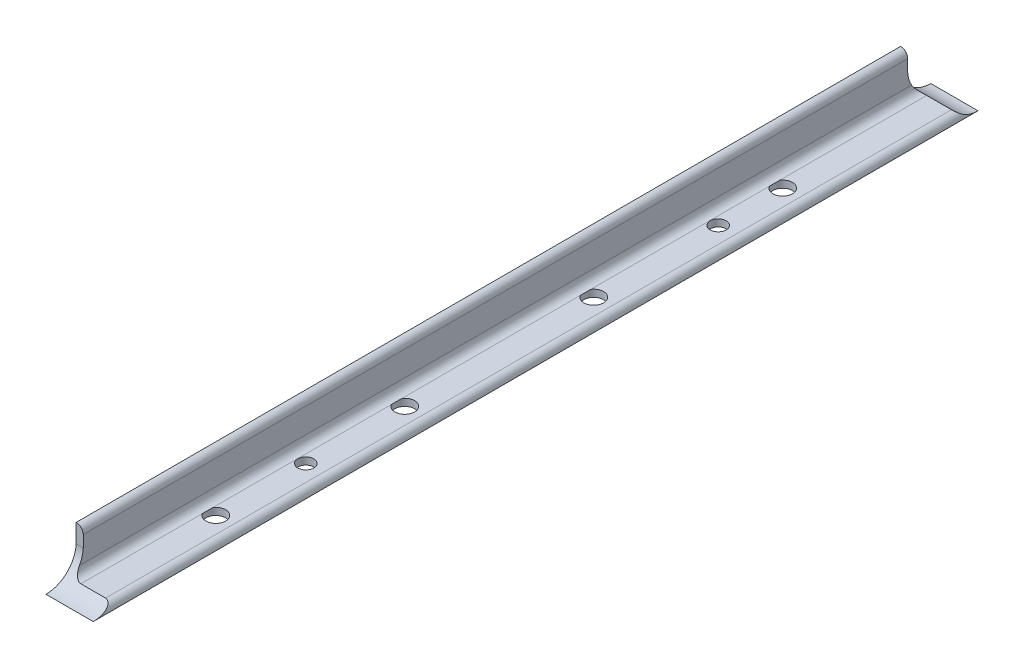
ISO-10303-21;
HEADER;
FILE_DESCRIPTION(('STEP AP214'),'2;1');
FILE_NAME('part.step','',(''),(''),'','','');
FILE_SCHEMA(('AUTOMOTIVE_DESIGN { 1 0 10303 214 1 1 1 1 }'));
ENDSEC;
DATA;
#1=APPLICATION_CONTEXT('core data for automotive mechanical design processes');
#2=APPLICATION_PROTOCOL_DEFINITION('international standard','automotive_design',2000,#1);
#3=PRODUCT_CONTEXT('',#1,'mechanical');
#4=PRODUCT('Part','Part','',(#3));
#5=PRODUCT_RELATED_PRODUCT_CATEGORY('part','',(#4));
#6=PRODUCT_DEFINITION_FORMATION('','',#4);
#7=PRODUCT_DEFINITION_CONTEXT('part definition',#1,'design');
#8=PRODUCT_DEFINITION('design','',#6,#7);
#9=PRODUCT_DEFINITION_SHAPE('','',#8);
#10=(LENGTH_UNIT() NAMED_UNIT(*) SI_UNIT(.MILLI.,.METRE.));
#11=(NAMED_UNIT(*) PLANE_ANGLE_UNIT() SI_UNIT($,.RADIAN.));
#12=(NAMED_UNIT(*) SI_UNIT($,.STERADIAN.) SOLID_ANGLE_UNIT());
#13=UNCERTAINTY_MEASURE_WITH_UNIT(LENGTH_MEASURE(1.E-05),#10,'distance_accuracy_value','');
#14=(GEOMETRIC_REPRESENTATION_CONTEXT(3) GLOBAL_UNCERTAINTY_ASSIGNED_CONTEXT((#13)) GLOBAL_UNIT_ASSIGNED_CONTEXT((#10,
#11,#12)) REPRESENTATION_CONTEXT('',''));
#15=CARTESIAN_POINT('',(0.,0.,0.));
#16=DIRECTION('',(0.,0.,1.));
#17=DIRECTION('',(1.,0.,0.));
#18=AXIS2_PLACEMENT_3D('',#15,#16,#17);
#19=CARTESIAN_POINT('',(20.,0.,181.370967741935));
#20=DIRECTION('',(0.,1.,0.));
#21=DIRECTION('',(0.,0.,1.));
#22=AXIS2_PLACEMENT_3D('',#19,#20,#21);
#23=PLANE('',#22);
#24=CARTESIAN_POINT('',(9.99999999999801,0.,-120.529032258062));
#25=DIRECTION('',(0.,-1.,0.));
#26=DIRECTION('',(0.,0.,-1.));
#27=AXIS2_PLACEMENT_3D('',#24,#25,#26);
#28=CIRCLE('',#27,4.1671875);
#29=CARTESIAN_POINT('',(9.99999999999801,0.,-124.696219758062));
#30=VERTEX_POINT('',#29);
#31=EDGE_CURVE('E244',#30,#30,#28,.T.);
#32=ORIENTED_EDGE('',*,*,#31,.F.);
#33=EDGE_LOOP('',(#32));
#34=FACE_BOUND('',#33,.T.);
#35=CARTESIAN_POINT('',(9.99999999999923,0.,119.470967741938));
#36=DIRECTION('',(0.,-1.,0.));
#37=DIRECTION('',(0.,0.,-1.));
#38=AXIS2_PLACEMENT_3D('',#35,#36,#37);
#39=CIRCLE('',#38,4.1671875);
#40=CARTESIAN_POINT('',(9.99999999999923,0.,115.303780241938));
#41=VERTEX_POINT('',#40);
#42=EDGE_CURVE('E249',#41,#41,#39,.T.);
#43=ORIENTED_EDGE('',*,*,#42,.F.);
#44=EDGE_LOOP('',(#43));
#45=FACE_BOUND('',#44,.T.);
#46=CARTESIAN_POINT('',(9.99999999999879,0.,39.4709677419378));
#47=DIRECTION('',(0.,-1.,0.));
#48=DIRECTION('',(0.,0.,-1.));
#49=AXIS2_PLACEMENT_3D('',#46,#47,#48);
#50=CIRCLE('',#49,4.1671875);
#51=CARTESIAN_POINT('',(9.99999999999879,0.,35.3037802419378));
#52=VERTEX_POINT('',#51);
#53=EDGE_CURVE('E255',#52,#52,#50,.T.);
#54=ORIENTED_EDGE('',*,*,#53,.F.);
#55=EDGE_LOOP('',(#54));
#56=FACE_BOUND('',#55,.T.);
#57=CARTESIAN_POINT('',(9.99999999999845,0.,-40.5290322580622));
#58=DIRECTION('',(0.,-1.,0.));
#59=DIRECTION('',(0.,0.,-1.));
#60=AXIS2_PLACEMENT_3D('',#57,#58,#59);
#61=CIRCLE('',#60,4.1671875);
#62=CARTESIAN_POINT('',(9.99999999999845,0.,-44.6962197580622));
#63=VERTEX_POINT('',#62);
#64=EDGE_CURVE('E177',#63,#63,#61,.T.);
#65=ORIENTED_EDGE('',*,*,#64,.F.);
#66=EDGE_LOOP('',(#65));
#67=FACE_BOUND('',#66,.T.);
#68=CARTESIAN_POINT('',(10.,0.,-93.2290322580646));
#69=DIRECTION('',(0.,-1.,0.));
#70=DIRECTION('',(0.,0.,-1.));
#71=AXIS2_PLACEMENT_3D('',#68,#69,#70);
#72=CIRCLE('',#71,3.3782);
#73=CARTESIAN_POINT('',(10.,0.,-96.6072322580646));
#74=VERTEX_POINT('',#73);
#75=EDGE_CURVE('E259',#74,#74,#72,.T.);
#76=ORIENTED_EDGE('',*,*,#75,.F.);
#77=EDGE_LOOP('',(#76));
#78=FACE_BOUND('',#77,.T.);
#79=DIRECTION('',(1.,0.,0.));
#80=VECTOR('',#79,1.);
#81=CARTESIAN_POINT('',(20.,0.,-193.229032258065));
#82=LINE('',#81,#80);
#83=CARTESIAN_POINT('',(0.,0.,-193.229032258065));
#84=VERTEX_POINT('',#83);
#85=CARTESIAN_POINT('',(20.,0.,-193.229032258065));
#86=VERTEX_POINT('',#85);
#87=EDGE_CURVE('E206',#84,#86,#82,.T.);
#88=ORIENTED_EDGE('',*,*,#87,.T.);
#89=DIRECTION('',(0.,0.,-1.));
#90=VECTOR('',#89,1.);
#91=CARTESIAN_POINT('',(20.,0.,181.370967741935));
#92=LINE('',#91,#90);
#93=CARTESIAN_POINT('',(20.,0.,181.370967741935));
#94=VERTEX_POINT('',#93);
#95=EDGE_CURVE('E70',#94,#86,#92,.T.);
#96=ORIENTED_EDGE('',*,*,#95,.F.);
#97=DIRECTION('',(1.,0.,0.));
#98=VECTOR('',#97,1.);
#99=CARTESIAN_POINT('',(20.,0.,181.370967741935));
#100=LINE('',#99,#98);
#101=CARTESIAN_POINT('',(0.,0.,181.370967741935));
#102=VERTEX_POINT('',#101);
#103=EDGE_CURVE('E213',#102,#94,#100,.T.);
#104=ORIENTED_EDGE('',*,*,#103,.F.);
#105=DIRECTION('',(0.,0.,-1.));
#106=VECTOR('',#105,1.);
#107=CARTESIAN_POINT('',(0.,0.,181.370967741935));
#108=LINE('',#107,#106);
#109=EDGE_CURVE('E209',#102,#84,#108,.T.);
#110=ORIENTED_EDGE('',*,*,#109,.T.);
#111=EDGE_LOOP('',(#88,#96,#104,#110));
#112=FACE_BOUND('',#111,.T.);
#113=CARTESIAN_POINT('',(10.,0.,81.3709677419355));
#114=DIRECTION('',(0.,-1.,0.));
#115=DIRECTION('',(0.,0.,-1.));
#116=AXIS2_PLACEMENT_3D('',#113,#114,#115);
#117=CIRCLE('',#116,3.3782);
#118=CARTESIAN_POINT('',(10.,0.,77.9927677419355));
#119=VERTEX_POINT('',#118);
#120=EDGE_CURVE('E168',#119,#119,#117,.T.);
#121=ORIENTED_EDGE('',*,*,#120,.F.);
#122=EDGE_LOOP('',(#121));
#123=FACE_BOUND('',#122,.T.);
#124=ADVANCED_FACE('F62',(#34,#45,#56,#67,#78,#112,#123),#23,.F.);
#125=CARTESIAN_POINT('',(3.,17.,181.370967741935));
#126=DIRECTION('',(-1.,0.,0.));
#127=DIRECTION('',(0.,-1.,0.));
#128=AXIS2_PLACEMENT_3D('',#125,#126,#127);
#129=PLANE('',#128);
#130=DIRECTION('',(0.,-1.,0.));
#131=VECTOR('',#130,1.);
#132=CARTESIAN_POINT('',(3.,17.,-180.447153459444));
#133=LINE('',#132,#131);
#134=CARTESIAN_POINT('',(3.,17.,-180.447153459444));
#135=VERTEX_POINT('',#134);
#136=CARTESIAN_POINT('',(3.,12.1191370348098,-180.447153459444));
#137=VERTEX_POINT('',#136);
#138=EDGE_CURVE('E302',#135,#137,#133,.T.);
#139=ORIENTED_EDGE('',*,*,#138,.F.);
#140=DIRECTION('',(0.,0.,-1.));
#141=VECTOR('',#140,1.);
#142=CARTESIAN_POINT('',(3.,17.,181.370967741935));
#143=LINE('',#142,#141);
#144=CARTESIAN_POINT('',(3.,17.,168.589088943315));
#145=VERTEX_POINT('',#144);
#146=EDGE_CURVE('E224',#145,#135,#143,.T.);
#147=ORIENTED_EDGE('',*,*,#146,.F.);
#148=DIRECTION('',(0.,-1.,0.));
#149=VECTOR('',#148,1.);
#150=CARTESIAN_POINT('',(3.,17.,168.589088943315));
#151=LINE('',#150,#149);
#152=CARTESIAN_POINT('',(3.,12.1191370348098,168.589088943315));
#153=VERTEX_POINT('',#152);
#154=EDGE_CURVE('E214',#145,#153,#151,.T.);
#155=ORIENTED_EDGE('',*,*,#154,.T.);
#156=CARTESIAN_POINT('',(3.,12.8,181.370967741935));
#157=DIRECTION('',(-1.,0.,0.));
#158=DIRECTION('',(0.,-1.,0.));
#159=AXIS2_PLACEMENT_3D('',#156,#157,#158);
#160=CIRCLE('',#159,12.8);
#161=CARTESIAN_POINT('',(3.,6.5,170.228705853073));
#162=VERTEX_POINT('',#161);
#163=EDGE_CURVE('E331',#162,#153,#160,.F.);
#164=ORIENTED_EDGE('',*,*,#163,.F.);
#165=DIRECTION('',(0.,0.,-1.));
#166=VECTOR('',#165,1.);
#167=CARTESIAN_POINT('',(3.,6.5,181.370967741935));
#168=LINE('',#167,#166);
#169=CARTESIAN_POINT('',(3.,6.5,-182.086770369202));
#170=VERTEX_POINT('',#169);
#171=EDGE_CURVE('E189',#162,#170,#168,.T.);
#172=ORIENTED_EDGE('',*,*,#171,.T.);
#173=CARTESIAN_POINT('',(3.,12.8,-193.229032258065));
#174=DIRECTION('',(-1.,0.,0.));
#175=DIRECTION('',(0.,-1.,0.));
#176=AXIS2_PLACEMENT_3D('',#173,#174,#175);
#177=CIRCLE('',#176,12.8);
#178=EDGE_CURVE('E272',#170,#137,#177,.T.);
#179=ORIENTED_EDGE('',*,*,#178,.T.);
#180=EDGE_LOOP('',(#139,#147,#155,#164,#172,#179));
#181=FACE_BOUND('',#180,.T.);
#182=ADVANCED_FACE('F344',(#181),#129,.F.);
#183=CARTESIAN_POINT('',(0.,0.,181.370967741935));
#184=DIRECTION('',(1.,0.,0.));
#185=DIRECTION('',(0.,0.,-1.));
#186=AXIS2_PLACEMENT_3D('',#183,#184,#185);
#187=PLANE('',#186);
#188=DIRECTION('',(0.,-1.,0.));
#189=VECTOR('',#188,1.);
#190=CARTESIAN_POINT('',(0.,22.8519845918242,-180.447153459444));
#191=LINE('',#190,#189);
#192=CARTESIAN_POINT('',(0.,20.,-180.447153459444));
#193=VERTEX_POINT('',#192);
#194=CARTESIAN_POINT('',(0.,12.1191370348098,-180.447153459444));
#195=VERTEX_POINT('',#194);
#196=EDGE_CURVE('E269',#193,#195,#191,.T.);
#197=ORIENTED_EDGE('',*,*,#196,.T.);
#198=CARTESIAN_POINT('',(0.,12.8,-193.229032258065));
#199=DIRECTION('',(-1.,0.,0.));
#200=DIRECTION('',(0.,0.,1.));
#201=AXIS2_PLACEMENT_3D('',#198,#199,#200);
#202=CIRCLE('',#201,12.8);
#203=EDGE_CURVE('E267',#84,#195,#202,.T.);
#204=ORIENTED_EDGE('',*,*,#203,.F.);
#205=ORIENTED_EDGE('',*,*,#109,.F.);
#206=CARTESIAN_POINT('',(0.,12.8,181.370967741935));
#207=DIRECTION('',(-1.,0.,0.));
#208=DIRECTION('',(0.,0.,1.));
#209=AXIS2_PLACEMENT_3D('',#206,#207,#208);
#210=CIRCLE('',#209,12.8);
#211=CARTESIAN_POINT('',(0.,12.1191370348098,168.589088943315));
#212=VERTEX_POINT('',#211);
#213=EDGE_CURVE('E337',#102,#212,#210,.F.);
#214=ORIENTED_EDGE('',*,*,#213,.T.);
#215=DIRECTION('',(0.,-1.,0.));
#216=VECTOR('',#215,1.);
#217=CARTESIAN_POINT('',(0.,0.,168.589088943315));
#218=LINE('',#217,#216);
#219=CARTESIAN_POINT('',(0.,20.,168.589088943315));
#220=VERTEX_POINT('',#219);
#221=EDGE_CURVE('E335',#220,#212,#218,.T.);
#222=ORIENTED_EDGE('',*,*,#221,.F.);
#223=DIRECTION('',(0.,0.,-1.));
#224=VECTOR('',#223,1.);
#225=CARTESIAN_POINT('',(0.,20.,181.370967741935));
#226=LINE('',#225,#224);
#227=EDGE_CURVE('E222',#220,#193,#226,.T.);
#228=ORIENTED_EDGE('',*,*,#227,.T.);
#229=EDGE_LOOP('',(#197,#204,#205,#214,#222,#228));
#230=FACE_BOUND('',#229,.T.);
#231=ADVANCED_FACE('F322',(#230),#187,.F.);
#232=CARTESIAN_POINT('',(0.,17.,181.370967741935));
#233=DIRECTION('',(0.,0.,-1.));
#234=DIRECTION('',(-1.,0.,0.));
#235=AXIS2_PLACEMENT_3D('',#232,#233,#234);
#236=CYLINDRICAL_SURFACE('',#235,3.);
#237=CARTESIAN_POINT('',(0.,17.,-180.447153459444));
#238=DIRECTION('',(0.,0.,-1.));
#239=DIRECTION('',(-1.,0.,0.));
#240=AXIS2_PLACEMENT_3D('',#237,#238,#239);
#241=CIRCLE('',#240,3.);
#242=EDGE_CURVE('E13',#193,#135,#241,.T.);
#243=ORIENTED_EDGE('',*,*,#242,.F.);
#244=ORIENTED_EDGE('',*,*,#227,.F.);
#245=CARTESIAN_POINT('',(0.,17.,168.589088943315));
#246=DIRECTION('',(0.,0.,-1.));
#247=DIRECTION('',(-1.,0.,0.));
#248=AXIS2_PLACEMENT_3D('',#245,#246,#247);
#249=CIRCLE('',#248,3.);
#250=EDGE_CURVE('E218',#220,#145,#249,.T.);
#251=ORIENTED_EDGE('',*,*,#250,.T.);
#252=ORIENTED_EDGE('',*,*,#146,.T.);
#253=EDGE_LOOP('',(#243,#244,#251,#252));
#254=FACE_BOUND('',#253,.T.);
#255=ADVANCED_FACE('F306',(#254),#236,.T.);
#256=CARTESIAN_POINT('',(17.,0.,181.370967741935));
#257=DIRECTION('',(0.,0.,-1.));
#258=DIRECTION('',(-1.,0.,0.));
#259=AXIS2_PLACEMENT_3D('',#256,#257,#258);
#260=CYLINDRICAL_SURFACE('',#259,3.);
#261=ORIENTED_EDGE('',*,*,#95,.T.);
#262=CARTESIAN_POINT('',(20.,0.,-193.229032258065));
#263=CARTESIAN_POINT('',(19.9999705919109,-2.30458044444742E-06,-193.051286959261));
#264=CARTESIAN_POINT('',(19.9999989770571,0.00370226592439756,-192.873541801661));
#265=CARTESIAN_POINT('',(19.9999599122282,0.0185087719111421,-192.518355839031));
#266=CARTESIAN_POINT('',(19.9998924600866,0.0296108746273757,-192.340915040974));
#267=CARTESIAN_POINT('',(19.9994499094464,0.0592209383889576,-191.986352009699));
#268=CARTESIAN_POINT('',(19.9990742937025,0.0777413240784776,-191.809230814235));
#269=CARTESIAN_POINT('',(19.9975949282692,0.12215425429108,-191.455920397352));
#270=CARTESIAN_POINT('',(19.9964911898514,0.148046684689877,-191.279731161548));
#271=CARTESIAN_POINT('',(19.9929752074295,0.207329591468886,-190.927571761546));
#272=CARTESIAN_POINT('',(19.990555359875,0.240762970703647,-190.751608884925));
#273=CARTESIAN_POINT('',(19.9836522455287,0.314973916303353,-190.401280315793));
#274=CARTESIAN_POINT('',(19.9791690254037,0.355751316557974,-190.226914587251));
#275=CARTESIAN_POINT('',(19.967222709024,0.44451448317191,-189.880308753322));
#276=CARTESIAN_POINT('',(19.9597625459986,0.49249312508783,-189.708066727127));
#277=CARTESIAN_POINT('',(19.9407600650472,0.595547736239835,-189.365970487646));
#278=CARTESIAN_POINT('',(19.9292185156823,0.650622367998199,-189.196115831055));
#279=CARTESIAN_POINT('',(19.9024685493768,0.760575693164321,-188.879685982737));
#280=CARTESIAN_POINT('',(19.887874684371,0.814667920668091,-188.732786020236));
#281=CARTESIAN_POINT('',(19.853481433853,0.927982337980096,-188.441590472269));
#282=CARTESIAN_POINT('',(19.8336823059246,0.987204273846342,-188.297294758309));
#283=CARTESIAN_POINT('',(19.7876954025515,1.11044027648881,-188.011913254042));
#284=CARTESIAN_POINT('',(19.7615123704582,1.17445076092479,-187.870825165116));
#285=CARTESIAN_POINT('',(19.7013693405175,1.30686409439147,-187.592404327919));
#286=CARTESIAN_POINT('',(19.6674102916596,1.37526640670856,-187.455071123687));
#287=CARTESIAN_POINT('',(19.5957588590613,1.50556478484685,-187.204694396706));
#288=CARTESIAN_POINT('',(19.5593322138692,1.56695585378169,-187.091028274171));
#289=CARTESIAN_POINT('',(19.4785163705227,1.69189081979229,-186.867721539012));
#290=CARTESIAN_POINT('',(19.4341258880657,1.75543506276088,-186.758081579115));
#291=CARTESIAN_POINT('',(19.3362692288105,1.88370363459148,-186.543974007168));
#292=CARTESIAN_POINT('',(19.2828231460853,1.94842507345107,-186.439495590787));
#293=CARTESIAN_POINT('',(19.1655479709184,2.07798702817958,-186.236685701539));
#294=CARTESIAN_POINT('',(19.101725952208,2.14282743337524,-186.138350103626));
#295=CARTESIAN_POINT('',(18.949823164493,2.28269447552457,-185.932154258203));
#296=CARTESIAN_POINT('',(18.859443382443,2.35745098877728,-185.825771184952));
#297=CARTESIAN_POINT('',(18.6607215587142,2.50140061225797,-185.62680223184));
#298=CARTESIAN_POINT('',(18.5523984627189,2.57059947737115,-185.534201992933));
#299=CARTESIAN_POINT('',(18.3377433168696,2.68750138374115,-185.381421994537));
#300=CARTESIAN_POINT('',(18.2343482603598,2.73684935436312,-185.318404616478));
#301=CARTESIAN_POINT('',(18.0157301558414,2.82526779578833,-185.207200865328));
#302=CARTESIAN_POINT('',(17.9005149294212,2.86434500270211,-185.159004768111));
#303=CARTESIAN_POINT('',(17.6772358802356,2.9245227102832,-185.085513498367));
#304=CARTESIAN_POINT('',(17.5703779091804,2.94735939747825,-185.057976395426));
#305=CARTESIAN_POINT('',(17.3522544969218,2.98127870354691,-185.017245847923));
#306=CARTESIAN_POINT('',(17.2409999263106,2.99238863543523,-185.004019071095));
#307=CARTESIAN_POINT('',(17.1077454898132,2.99814309911651,-184.997167444306));
#308=CARTESIAN_POINT('',(17.0862001547962,2.99883941073956,-184.996338319584));
#309=CARTESIAN_POINT('',(17.0431054203398,2.99976710034989,-184.995233756004));
#310=CARTESIAN_POINT('',(17.0215560434937,2.99999891199695,-184.994957800703));
#311=CARTESIAN_POINT('',(17.,3.,-184.994956717969));
#312=B_SPLINE_CURVE_WITH_KNOTS('',3,(#262,#263,#264,#265,#266,#267,#268,#269,#270,#271,#272,
#273,#274,#275,#276,#277,#278,#279,#280,#281,#282,#283,#284,#285,#286,#287,#288,#289,#290,#291,
#292,#293,#294,#295,#296,#297,#298,#299,#300,#301,#302,#303,#304,#305,#306,#307,#308,#309,#310,
#311),.UNSPECIFIED.,.F.,.F.,(4,2,2,2,2,2,2,2,2,2,2,2,2,2,2,2,2,2,2,2,2,2,2,2,4),(0.,
0.533197095279341,1.06640624483334,1.60051220873634,2.13460990476388,2.67182653411167,
3.20903101398115,3.74570747957591,4.28228293803239,4.75377659608734,5.22524692656226,
5.69636800828244,6.16743162473256,6.56983043551348,6.97229419829314,7.3738763309348,
7.77518582667768,8.24881684700326,8.72195092873459,9.11270874235857,9.50320963318574,
9.83984379905433,10.1756921618371,10.2404043939398,10.3050561821395),.UNSPECIFIED.);
#313=CARTESIAN_POINT('',(17.,3.,-184.994956717969));
#314=VERTEX_POINT('',#313);
#315=EDGE_CURVE('E201',#86,#314,#312,.T.);
#316=ORIENTED_EDGE('',*,*,#315,.T.);
#317=DIRECTION('',(0.,0.,-1.));
#318=VECTOR('',#317,1.);
#319=CARTESIAN_POINT('',(17.,3.,181.370967741935));
#320=LINE('',#319,#318);
#321=CARTESIAN_POINT('',(17.,3.,173.13689220184));
#322=VERTEX_POINT('',#321);
#323=EDGE_CURVE('E186',#322,#314,#320,.T.);
#324=ORIENTED_EDGE('',*,*,#323,.F.);
#325=CARTESIAN_POINT('',(20.,0.,181.370967741935));
#326=CARTESIAN_POINT('',(19.9999705919109,-2.30458044194346E-06,181.193222443132));
#327=CARTESIAN_POINT('',(19.9999989770571,0.00370226592439845,181.015477285531));
#328=CARTESIAN_POINT('',(19.9999599122282,0.0185087719111417,180.660291322902));
#329=CARTESIAN_POINT('',(19.9998924600866,0.0296108746273757,180.482850524844));
#330=CARTESIAN_POINT('',(19.9994499094464,0.0592209383889577,180.12828749357));
#331=CARTESIAN_POINT('',(19.9990742937025,0.0777413240784775,179.951166298106));
#332=CARTESIAN_POINT('',(19.9975949282692,0.12215425429108,179.597855881223));
#333=CARTESIAN_POINT('',(19.9964911898514,0.148046684689877,179.421666645419));
#334=CARTESIAN_POINT('',(19.9929752074295,0.207329591468884,179.069507245417));
#335=CARTESIAN_POINT('',(19.990555359875,0.240762970703644,178.893544368796));
#336=CARTESIAN_POINT('',(19.9836522455287,0.314973916303348,178.543215799664));
#337=CARTESIAN_POINT('',(19.9791690254037,0.355751316557968,178.368850071122));
#338=CARTESIAN_POINT('',(19.967222709024,0.444514483171902,178.022244237193));
#339=CARTESIAN_POINT('',(19.9597625459986,0.492493125087821,177.850002210998));
#340=CARTESIAN_POINT('',(19.9407600650472,0.595547736239828,177.507905971517));
#341=CARTESIAN_POINT('',(19.9292185156824,0.650622367998196,177.338051314926));
#342=CARTESIAN_POINT('',(19.9024685493768,0.760575693164322,177.021621466608));
#343=CARTESIAN_POINT('',(19.887874684371,0.814667920668092,176.874721504107));
#344=CARTESIAN_POINT('',(19.853481433853,0.927982337980096,176.58352595614));
#345=CARTESIAN_POINT('',(19.8336823059246,0.987204273846343,176.43923024218));
#346=CARTESIAN_POINT('',(19.7876954025515,1.11044027648881,176.153848737913));
#347=CARTESIAN_POINT('',(19.7615123704582,1.17445076092479,176.012760648987));
#348=CARTESIAN_POINT('',(19.7013693405175,1.30686409439147,175.73433981179));
#349=CARTESIAN_POINT('',(19.6674102916596,1.37526640670856,175.597006607558));
#350=CARTESIAN_POINT('',(19.5957588590613,1.50556478484684,175.346629880577));
#351=CARTESIAN_POINT('',(19.5593322138692,1.56695585378168,175.232963758042));
#352=CARTESIAN_POINT('',(19.4785163705227,1.69189081979227,175.009657022883));
#353=CARTESIAN_POINT('',(19.4341258880658,1.75543506276085,174.900017062986));
#354=CARTESIAN_POINT('',(19.3362692288105,1.88370363459145,174.685909491039));
#355=CARTESIAN_POINT('',(19.2828231460854,1.94842507345105,174.581431074658));
#356=CARTESIAN_POINT('',(19.1655479709184,2.07798702817957,174.37862118541));
#357=CARTESIAN_POINT('',(19.101725952208,2.14282743337523,174.280285587497));
#358=CARTESIAN_POINT('',(18.949823164493,2.28269447552457,174.074089742074));
#359=CARTESIAN_POINT('',(18.859443382443,2.35745098877728,173.967706668823));
#360=CARTESIAN_POINT('',(18.6607215587142,2.50140061225797,173.768737715711));
#361=CARTESIAN_POINT('',(18.5523984627189,2.57059947737115,173.676137476804));
#362=CARTESIAN_POINT('',(18.3377433168696,2.68750138374115,173.523357478408));
#363=CARTESIAN_POINT('',(18.2343482603598,2.73684935436311,173.460340100349));
#364=CARTESIAN_POINT('',(18.0157301558414,2.82526779578833,173.349136349199));
#365=CARTESIAN_POINT('',(17.9005149294213,2.8643450027021,173.300940251982));
#366=CARTESIAN_POINT('',(17.6772358802356,2.9245227102832,173.227448982238));
#367=CARTESIAN_POINT('',(17.5703779091804,2.94735939747825,173.199911879297));
#368=CARTESIAN_POINT('',(17.3522544969218,2.9812787035469,173.159181331794));
#369=CARTESIAN_POINT('',(17.2409999263106,2.99238863543523,173.145954554966));
#370=CARTESIAN_POINT('',(17.1077454898133,2.99814309911651,173.139102928177));
#371=CARTESIAN_POINT('',(17.0862001547962,2.99883941073956,173.138273803455));
#372=CARTESIAN_POINT('',(17.0431054203398,2.99976710034989,173.137169239875));
#373=CARTESIAN_POINT('',(17.0215560434937,2.99999891199695,173.136893284574));
#374=CARTESIAN_POINT('',(17.,3.,173.13689220184));
#375=B_SPLINE_CURVE_WITH_KNOTS('',3,(#325,#326,#327,#328,#329,#330,#331,#332,#333,#334,#335,
#336,#337,#338,#339,#340,#341,#342,#343,#344,#345,#346,#347,#348,#349,#350,#351,#352,#353,#354,
#355,#356,#357,#358,#359,#360,#361,#362,#363,#364,#365,#366,#367,#368,#369,#370,#371,#372,#373,
#374),.UNSPECIFIED.,.F.,.F.,(4,2,2,2,2,2,2,2,2,2,2,2,2,2,2,2,2,2,2,2,2,2,2,2,4),(0.,
0.533197095279341,1.06640624483334,1.60051220873634,2.13460990476388,2.67182653411164,
3.20903101398112,3.74570747957588,4.28228293803239,4.75377659608734,5.22524692656226,
5.69636800828244,6.16743162473256,6.56983043551342,6.97229419829307,7.37387633093476,
7.77518582667768,8.24881684700329,8.72195092873459,9.11270874235856,9.50320963318571,
9.83984379905431,10.1756921618371,10.2404043939398,10.3050561821395),.UNSPECIFIED.);
#376=EDGE_CURVE('E202',#94,#322,#375,.T.);
#377=ORIENTED_EDGE('',*,*,#376,.F.);
#378=EDGE_LOOP('',(#261,#316,#324,#377));
#379=FACE_BOUND('',#378,.T.);
#380=ADVANCED_FACE('F199',(#379),#260,.T.);
#381=CARTESIAN_POINT('',(6.5,3.,181.370967741935));
#382=DIRECTION('',(0.,-1.,0.));
#383=DIRECTION('',(0.,0.,-1.));
#384=AXIS2_PLACEMENT_3D('',#381,#382,#383);
#385=PLANE('',#384);
#386=CARTESIAN_POINT('',(10.,3.,81.3709677419355));
#387=DIRECTION('',(0.,-1.,0.));
#388=DIRECTION('',(0.,0.,-1.));
#389=AXIS2_PLACEMENT_3D('',#386,#387,#388);
#390=CIRCLE('',#389,3.3782);
#391=CARTESIAN_POINT('',(10.,3.,77.9927677419355));
#392=VERTEX_POINT('',#391);
#393=EDGE_CURVE('E65',#392,#392,#390,.T.);
#394=ORIENTED_EDGE('',*,*,#393,.T.);
#395=EDGE_LOOP('',(#394));
#396=FACE_BOUND('',#395,.T.);
#397=CARTESIAN_POINT('',(10.,3.,-93.2290322580646));
#398=DIRECTION('',(0.,-1.,0.));
#399=DIRECTION('',(0.,0.,-1.));
#400=AXIS2_PLACEMENT_3D('',#397,#398,#399);
#401=CIRCLE('',#400,3.3782);
#402=CARTESIAN_POINT('',(10.,3.,-96.6072322580646));
#403=VERTEX_POINT('',#402);
#404=EDGE_CURVE('E262',#403,#403,#401,.T.);
#405=ORIENTED_EDGE('',*,*,#404,.T.);
#406=EDGE_LOOP('',(#405));
#407=FACE_BOUND('',#406,.T.);
#408=DIRECTION('',(0.,0.,-1.));
#409=VECTOR('',#408,1.);
#410=CARTESIAN_POINT('',(6.5,3.,181.370967741935));
#411=LINE('',#410,#409);
#412=CARTESIAN_POINT('',(6.5,3.,-122.790768683946));
#413=VERTEX_POINT('',#412);
#414=CARTESIAN_POINT('',(6.5,3.,-184.994956717969));
#415=VERTEX_POINT('',#414);
#416=EDGE_CURVE('E188',#413,#415,#411,.T.);
#417=ORIENTED_EDGE('',*,*,#416,.F.);
#418=CARTESIAN_POINT('',(9.99999999999801,3.,-120.529032258062));
#419=DIRECTION('',(0.,-1.,0.));
#420=DIRECTION('',(0.,0.,-1.));
#421=AXIS2_PLACEMENT_3D('',#418,#419,#420);
#422=CIRCLE('',#421,4.1671875);
#423=CARTESIAN_POINT('',(6.5,3.,-118.267295832178));
#424=VERTEX_POINT('',#423);
#425=EDGE_CURVE('E243',#424,#413,#422,.F.);
#426=ORIENTED_EDGE('',*,*,#425,.F.);
#427=CARTESIAN_POINT('',(6.5,3.,-42.7907686839455));
#428=VERTEX_POINT('',#427);
#429=EDGE_CURVE('E160',#428,#424,#411,.T.);
#430=ORIENTED_EDGE('',*,*,#429,.F.);
#431=CARTESIAN_POINT('',(9.99999999999845,3.,-40.5290322580622));
#432=DIRECTION('',(0.,-1.,0.));
#433=DIRECTION('',(0.,0.,-1.));
#434=AXIS2_PLACEMENT_3D('',#431,#432,#433);
#435=CIRCLE('',#434,4.1671875);
#436=CARTESIAN_POINT('',(6.5,3.,-38.267295832179));
#437=VERTEX_POINT('',#436);
#438=EDGE_CURVE('E166',#437,#428,#435,.F.);
#439=ORIENTED_EDGE('',*,*,#438,.F.);
#440=CARTESIAN_POINT('',(6.5,3.,37.2092313160551));
#441=VERTEX_POINT('',#440);
#442=EDGE_CURVE('E159',#441,#437,#411,.T.);
#443=ORIENTED_EDGE('',*,*,#442,.F.);
#444=CARTESIAN_POINT('',(9.99999999999879,3.,39.4709677419378));
#445=DIRECTION('',(0.,-1.,0.));
#446=DIRECTION('',(0.,0.,-1.));
#447=AXIS2_PLACEMENT_3D('',#444,#445,#446);
#448=CIRCLE('',#447,4.1671875);
#449=CARTESIAN_POINT('',(6.5,3.,41.7327041678205));
#450=VERTEX_POINT('',#449);
#451=EDGE_CURVE('E372',#450,#441,#448,.F.);
#452=ORIENTED_EDGE('',*,*,#451,.F.);
#453=CARTESIAN_POINT('',(6.5,3.,117.209231316056));
#454=VERTEX_POINT('',#453);
#455=EDGE_CURVE('E182',#454,#450,#411,.T.);
#456=ORIENTED_EDGE('',*,*,#455,.F.);
#457=CARTESIAN_POINT('',(9.99999999999923,3.,119.470967741938));
#458=DIRECTION('',(0.,-1.,0.));
#459=DIRECTION('',(0.,0.,-1.));
#460=AXIS2_PLACEMENT_3D('',#457,#458,#459);
#461=CIRCLE('',#460,4.1671875);
#462=CARTESIAN_POINT('',(6.5,3.,121.73270416782));
#463=VERTEX_POINT('',#462);
#464=EDGE_CURVE('E253',#463,#454,#461,.F.);
#465=ORIENTED_EDGE('',*,*,#464,.F.);
#466=CARTESIAN_POINT('',(6.5,3.,173.13689220184));
#467=VERTEX_POINT('',#466);
#468=EDGE_CURVE('E183',#467,#463,#411,.T.);
#469=ORIENTED_EDGE('',*,*,#468,.F.);
#470=DIRECTION('',(-1.,0.,0.));
#471=VECTOR('',#470,1.);
#472=CARTESIAN_POINT('',(20.,3.,173.13689220184));
#473=LINE('',#472,#471);
#474=EDGE_CURVE('E315',#322,#467,#473,.T.);
#475=ORIENTED_EDGE('',*,*,#474,.F.);
#476=ORIENTED_EDGE('',*,*,#323,.T.);
#477=DIRECTION('',(-1.,0.,0.));
#478=VECTOR('',#477,1.);
#479=CARTESIAN_POINT('',(20.,3.,-184.994956717969));
#480=LINE('',#479,#478);
#481=EDGE_CURVE('E281',#314,#415,#480,.T.);
#482=ORIENTED_EDGE('',*,*,#481,.T.);
#483=EDGE_LOOP('',(#417,#426,#430,#439,#443,#452,#456,#465,#469,#475,#476,#482));
#484=FACE_BOUND('',#483,.T.);
#485=ADVANCED_FACE('F173',(#396,#407,#484),#385,.F.);
#486=CARTESIAN_POINT('',(6.5,6.5,181.370967741935));
#487=DIRECTION('',(0.,0.,-1.));
#488=DIRECTION('',(-1.,0.,0.));
#489=AXIS2_PLACEMENT_3D('',#486,#487,#488);
#490=CYLINDRICAL_SURFACE('',#489,3.5);
#491=ORIENTED_EDGE('',*,*,#468,.T.);
#492=EDGE_CURVE('E187',#463,#454,#411,.T.);
#493=ORIENTED_EDGE('',*,*,#492,.T.);
#494=ORIENTED_EDGE('',*,*,#455,.T.);
#495=EDGE_CURVE('E181',#450,#441,#411,.T.);
#496=ORIENTED_EDGE('',*,*,#495,.T.);
#497=ORIENTED_EDGE('',*,*,#442,.T.);
#498=EDGE_CURVE('E154',#437,#428,#411,.T.);
#499=ORIENTED_EDGE('',*,*,#498,.T.);
#500=ORIENTED_EDGE('',*,*,#429,.T.);
#501=EDGE_CURVE('E235',#424,#413,#411,.T.);
#502=ORIENTED_EDGE('',*,*,#501,.T.);
#503=ORIENTED_EDGE('',*,*,#416,.T.);
#504=CARTESIAN_POINT('',(3.,6.5,-182.086770369202));
#505=CARTESIAN_POINT('',(3.00001438430894,6.69249076170442,-181.977946193923));
#506=CARTESIAN_POINT('',(3.01594051187546,6.88807416675024,-181.874004428932));
#507=CARTESIAN_POINT('',(3.06557485987401,7.18164263873908,-181.727459113388));
#508=CARTESIAN_POINT('',(3.08644237048735,7.27962352718962,-181.680131693494));
#509=CARTESIAN_POINT('',(3.13699442735602,7.4748539406344,-181.588826737077));
#510=CARTESIAN_POINT('',(3.16667474862635,7.57210379324271,-181.544847608));
#511=CARTESIAN_POINT('',(3.23517396005617,7.76550179323353,-181.460215792076));
#512=CARTESIAN_POINT('',(3.27404079092235,7.86164128750162,-181.41958211697));
#513=CARTESIAN_POINT('',(3.36082247531485,8.05126694401865,-181.342063828531));
#514=CARTESIAN_POINT('',(3.40873338762511,8.1447542417011,-181.305177592874));
#515=CARTESIAN_POINT('',(3.51347524400578,8.32806191859333,-181.23522576763));
#516=CARTESIAN_POINT('',(3.57030391973867,8.41788322299031,-181.202159210165));
#517=CARTESIAN_POINT('',(3.69261254411521,8.59283647549663,-181.139847089441));
#518=CARTESIAN_POINT('',(3.75809167982938,8.67796886318442,-181.11060116765));
#519=CARTESIAN_POINT('',(3.89107527644851,8.83519824084306,-181.058305431863));
#520=CARTESIAN_POINT('',(3.95788083468138,8.90778104934892,-181.034935822053));
#521=CARTESIAN_POINT('',(4.09791701900059,9.04750553548503,-180.991216022285));
#522=CARTESIAN_POINT('',(4.17114980026799,9.11464537334483,-180.970866851345));
#523=CARTESIAN_POINT('',(4.32347513381163,9.24274163191565,-180.933082795667));
#524=CARTESIAN_POINT('',(4.40256449411882,9.30370137861543,-180.91564634006));
#525=CARTESIAN_POINT('',(4.56604695661097,9.41887726904528,-180.883523725139));
#526=CARTESIAN_POINT('',(4.65044197425143,9.47309095601436,-180.868838566804));
#527=CARTESIAN_POINT('',(4.90243753770416,9.61998061719608,-180.82994148785));
#528=CARTESIAN_POINT('',(5.07628267359169,9.70311855970735,-180.809119362952));
#529=CARTESIAN_POINT('',(5.43585501807313,9.83985791327713,-180.775817765641));
#530=CARTESIAN_POINT('',(5.62158134388367,9.89346151592604,-180.763337674194));
#531=CARTESIAN_POINT('',(5.99843462564227,9.96916523570845,-180.745928311165));
#532=CARTESIAN_POINT('',(6.18951808074272,9.99147002421159,-180.740949967655));
#533=CARTESIAN_POINT('',(6.5728083756654,10.0044939041429,-180.738027700644));
#534=CARTESIAN_POINT('',(6.7650152264914,9.99521268566409,-180.740083846161));
#535=CARTESIAN_POINT('',(7.14535882529886,9.94533622161214,-180.75139072858));
#536=CARTESIAN_POINT('',(7.3334900752315,9.9047010917387,-180.76065062927));
#537=CARTESIAN_POINT('',(7.70006790428329,9.79340624871359,-180.787021214557));
#538=CARTESIAN_POINT('',(7.87851479571284,9.72274750444165,-180.804131645813));
#539=CARTESIAN_POINT('',(8.2204915380453,9.55388852013163,-180.84717838456));
#540=CARTESIAN_POINT('',(8.38403553236298,9.45571476133489,-180.87310621103));
#541=CARTESIAN_POINT('',(8.69183848399811,9.23526503157179,-180.934898672994));
#542=CARTESIAN_POINT('',(8.83609891456236,9.11299090362002,-180.970762548739));
#543=CARTESIAN_POINT('',(9.10185076153749,8.84852631443398,-181.053440613371));
#544=CARTESIAN_POINT('',(9.22330175548543,8.70630126113878,-181.100273918207));
#545=CARTESIAN_POINT('',(9.44050472804682,8.40724904516878,-181.205354454769));
#546=CARTESIAN_POINT('',(9.53625562511617,8.25042126833759,-181.263602166672));
#547=CARTESIAN_POINT('',(9.70295467622913,7.92326400538631,-181.393105037982));
#548=CARTESIAN_POINT('',(9.77317726652261,7.75268667410302,-181.464664338812));
#549=CARTESIAN_POINT('',(9.88522354087848,7.40733617812518,-181.618908157562));
#550=CARTESIAN_POINT('',(9.92703814031437,7.23256168969862,-181.701596224245));
#551=CARTESIAN_POINT('',(9.98567836144706,6.86950658925918,-181.883825052467));
#552=CARTESIAN_POINT('',(10.0002168725691,6.68127340892849,-181.984187120211));
#553=CARTESIAN_POINT('',(9.9997779067599,6.31017455993753,-182.194191227966));
#554=CARTESIAN_POINT('',(9.98478971408138,6.12731086439929,-182.303836623237));
#555=CARTESIAN_POINT('',(9.92390651984181,5.74550152168849,-182.545776393554));
#556=CARTESIAN_POINT('',(9.87400449979792,5.54785431921679,-182.679100354346));
#557=CARTESIAN_POINT('',(9.74253140909784,5.16709585724981,-182.951211238011));
#558=CARTESIAN_POINT('',(9.66092238572634,4.98400233582886,-183.090004527991));
#559=CARTESIAN_POINT('',(9.5093138720257,4.70913768635393,-183.309629068773));
#560=CARTESIAN_POINT('',(9.44905661405105,4.61155428138046,-183.390091438161));
#561=CARTESIAN_POINT('',(9.31904490110324,4.42246476661921,-183.550589157782));
#562=CARTESIAN_POINT('',(9.24928825873389,4.33096006379836,-183.630624405237));
#563=CARTESIAN_POINT('',(9.10043568142347,4.15456834325592,-183.78919276254));
#564=CARTESIAN_POINT('',(9.02134402634644,4.06967832228167,-183.867726541729));
#565=CARTESIAN_POINT('',(8.85378497912893,3.90706405070726,-184.022064209484));
#566=CARTESIAN_POINT('',(8.7653215689126,3.82933678279651,-184.097869239259));
#567=CARTESIAN_POINT('',(8.54419449095081,3.65432063613167,-184.272641848613));
#568=CARTESIAN_POINT('',(8.40730044584545,3.56045813839488,-184.369781631361));
#569=CARTESIAN_POINT('',(8.11504952844722,3.39032282270294,-184.550705249341));
#570=CARTESIAN_POINT('',(7.95972806523423,3.31401707253233,-184.63451399766));
#571=CARTESIAN_POINT('',(7.67052967116049,3.19879941812471,-184.7636572914));
#572=CARTESIAN_POINT('',(7.54047079658602,3.15530794803642,-184.813397650376));
#573=CARTESIAN_POINT('',(7.27122561951198,3.08320136219005,-184.896751229433));
#574=CARTESIAN_POINT('',(7.13204991566184,3.05456930571819,-184.930382811196));
#575=CARTESIAN_POINT('',(6.91843994192544,3.02434422292118,-184.966055698026));
#576=CARTESIAN_POINT('',(6.84605648840914,3.0163823801741,-184.97549369804));
#577=CARTESIAN_POINT('',(6.70045084851068,3.00498381778933,-184.989023641999));
#578=CARTESIAN_POINT('',(6.62722907688282,3.00154495039176,-184.993118123336));
#579=CARTESIAN_POINT('',(6.48061500898489,2.99928583797149,-184.995806578777));
#580=CARTESIAN_POINT('',(6.40722271817422,3.00046544706456,-184.99440072662));
#581=CARTESIAN_POINT('',(6.26098414073311,3.00740230943953,-184.986153232399));
#582=CARTESIAN_POINT('',(6.18813782359142,3.01315930496348,-184.979311896414));
#583=CARTESIAN_POINT('',(5.98960278885126,3.03509294922052,-184.953339768753));
#584=CARTESIAN_POINT('',(5.86506792531202,3.05583991509931,-184.928847086569));
#585=CARTESIAN_POINT('',(5.62234318725358,3.10953683728016,-184.866221924738));
#586=CARTESIAN_POINT('',(5.50415706369826,3.14249391871369,-184.828081481476));
#587=CARTESIAN_POINT('',(5.22110302596563,3.23717131503062,-184.720238624231));
#588=CARTESIAN_POINT('',(5.06075634536663,3.30511707984001,-184.644151807097));
#589=CARTESIAN_POINT('',(4.75801677941518,3.45951634794141,-184.476410982807));
#590=CARTESIAN_POINT('',(4.61567268620369,3.5460185050461,-184.384716185513));
#591=CARTESIAN_POINT('',(4.38838668304209,3.7063888341386,-184.220410145527));
#592=CARTESIAN_POINT('',(4.29892626484598,3.77641637483911,-184.150185304611));
#593=CARTESIAN_POINT('',(4.12863270130011,3.92332108440584,-184.006496722768));
#594=CARTESIAN_POINT('',(4.04780298897321,4.00020095676954,-183.933031709299));
#595=CARTESIAN_POINT('',(3.81793326235753,4.24042367341213,-183.709512694328));
#596=CARTESIAN_POINT('',(3.68154650000393,4.41332524401066,-183.556360193151));
#597=CARTESIAN_POINT('',(3.50179533463081,4.69078523103986,-183.324702664143));
#598=CARTESIAN_POINT('',(3.44554395098374,4.78744898691103,-183.246294680911));
#599=CARTESIAN_POINT('',(3.34235665302382,4.98612557704909,-183.090033878387));
#600=CARTESIAN_POINT('',(3.29542086277517,5.08813848253258,-183.012181066502));
#601=CARTESIAN_POINT('',(3.21140131956177,5.29678180320949,-182.857990178844));
#602=CARTESIAN_POINT('',(3.17429234995159,5.4033995668572,-182.781648700447));
#603=CARTESIAN_POINT('',(3.1102772314797,5.62100070287198,-182.630943796643));
#604=CARTESIAN_POINT('',(3.08336969625692,5.73198347977544,-182.556580103737));
#605=CARTESIAN_POINT('',(3.04161466078598,5.95112389102166,-182.414740517816));
#606=CARTESIAN_POINT('',(3.02615406317882,6.05906736184057,-182.347116112564));
#607=CARTESIAN_POINT('',(3.00534045521204,6.27765940787622,-182.214702532099));
#608=CARTESIAN_POINT('',(2.99999165364332,6.38830909008731,-182.149914548433));
#609=CARTESIAN_POINT('',(3.,6.5,-182.086770369202));
#610=B_SPLINE_CURVE_WITH_KNOTS('',3,(#504,#505,#506,#507,#508,#509,#510,#511,#512,#513,#514,
#515,#516,#517,#518,#519,#520,#521,#522,#523,#524,#525,#526,#527,#528,#529,#530,#531,#532,#533,
#534,#535,#536,#537,#538,#539,#540,#541,#542,#543,#544,#545,#546,#547,#548,#549,#550,#551,#552,
#553,#554,#555,#556,#557,#558,#559,#560,#561,#562,#563,#564,#565,#566,#567,#568,#569,#570,#571,
#572,#573,#574,#575,#576,#577,#578,#579,#580,#581,#582,#583,#584,#585,#586,#587,#588,#589,#590,
#591,#592,#593,#594,#595,#596,#597,#598,#599,#600,#601,#602,#603,#604,#605,#606,#607,#608,#609),
.UNSPECIFIED.,.T.,.F.,(4,2,2,2,2,2,2,2,2,2,2,2,2,2,2,2,2,2,2,2,2,2,2,2,2,2,2,2,2,2,2,2,2,2,2,2,
2,2,2,2,2,2,2,2,2,2,2,2,2,2,2,2,4),(0.,0.662882730422418,0.994951079985773,1.32686048766405,
1.66054180626078,1.99407804800974,2.32752958801968,2.66094981408571,2.96469592040256,
3.26854427109959,3.57222821942123,3.87602244083048,4.45446524042121,5.03286511098483,
5.60746475798361,6.18207004269996,6.75740747176496,7.33272633576208,7.9074933865821,
8.482216500592,9.05794871090191,9.63370514610784,10.224739358494,10.8159624895855,
11.454863475465,12.0939963721861,12.8219821008045,13.5508419133266,13.9707495802678,
14.3907541021653,14.8105668053331,15.2302018461189,15.8053592809236,16.3794289003909,
16.8155249824884,17.2511227879622,17.4711217511511,17.6910162088531,17.910903720786,
18.1307788514749,18.5148151564762,18.8990759171874,19.4660322769216,20.0344937407803,
20.4346711919256,20.8350072326839,21.6358242461031,22.0452797787853,22.4547407641926,
22.863140618435,23.2714849517812,23.6559562778156,24.0405875955512),.UNSPECIFIED.);
#611=EDGE_CURVE('E274',#415,#170,#610,.T.);
#612=ORIENTED_EDGE('',*,*,#611,.T.);
#613=ORIENTED_EDGE('',*,*,#171,.F.);
#614=CARTESIAN_POINT('',(6.5,3.,173.13689220184));
#615=CARTESIAN_POINT('',(6.42259108530008,2.99997615779608,173.136932021426));
#616=CARTESIAN_POINT('',(6.34521049613182,3.00256706100367,173.133837102259));
#617=CARTESIAN_POINT('',(6.19136579467073,3.01278988354558,173.121687121326));
#618=CARTESIAN_POINT('',(6.11490049437666,3.02041432834784,173.112640896992));
#619=CARTESIAN_POINT('',(5.96446156854595,3.04039073339572,173.089044842414));
#620=CARTESIAN_POINT('',(5.89046872198488,3.05268221409427,173.074565447065));
#621=CARTESIAN_POINT('',(5.74453320695992,3.08169470633635,173.040598908345));
#622=CARTESIAN_POINT('',(5.67259118600823,3.0984171000762,173.021110202407));
#623=CARTESIAN_POINT('',(5.46134232275791,3.15451109226658,172.956231600432));
#624=CARTESIAN_POINT('',(5.32560308966281,3.19995076456175,172.904257977799));
#625=CARTESIAN_POINT('',(5.06521771658112,3.30449808161049,172.787166477012));
#626=CARTESIAN_POINT('',(4.94061599472347,3.36365734275349,172.721999081333));
#627=CARTESIAN_POINT('',(4.63495085625347,3.53066685700255,172.542507785088));
#628=CARTESIAN_POINT('',(4.46243245339309,3.64699617808637,172.421409770992));
#629=CARTESIAN_POINT('',(4.22487160874183,3.83839199521029,172.231064195176));
#630=CARTESIAN_POINT('',(4.14913969907257,3.90510128800764,172.166079482328));
#631=CARTESIAN_POINT('',(4.00459301331332,4.04379057810757,172.034055073548));
#632=CARTESIAN_POINT('',(3.93577730321153,4.11576986143842,171.967015656696));
#633=CARTESIAN_POINT('',(3.73532294750269,4.34396280941257,171.759593869105));
#634=CARTESIAN_POINT('',(3.61483446400873,4.50824201431266,171.617142426288));
#635=CARTESIAN_POINT('',(3.40405625194774,4.85495554091958,171.332717711562));
#636=CARTESIAN_POINT('',(3.31371585356481,5.03735872506837,171.190744038397));
#637=CARTESIAN_POINT('',(3.20100978506624,5.3261815759383,170.978804607802));
#638=CARTESIAN_POINT('',(3.16686594513598,5.42686221514029,170.907106123448));
#639=CARTESIAN_POINT('',(3.10764061744334,5.63207157635464,170.765482110786));
#640=CARTESIAN_POINT('',(3.0825576099369,5.73659964980553,170.695556286986));
#641=CARTESIAN_POINT('',(3.04188178935846,5.94937350227185,170.557780897233));
#642=CARTESIAN_POINT('',(3.02632271989438,6.05763108089712,170.48993951338));
#643=CARTESIAN_POINT('',(3.00537924035695,6.27691986485622,170.357068211929));
#644=CARTESIAN_POINT('',(3.0000020145823,6.38795297267195,170.292040311112));
#645=CARTESIAN_POINT('',(3.,6.50000000000001,170.228705853073));
#646=B_SPLINE_CURVE_WITH_KNOTS('',3,(#614,#615,#616,#617,#618,#619,#620,#621,#622,#623,#624,
#625,#626,#627,#628,#629,#630,#631,#632,#633,#634,#635,#636,#637,#638,#639,#640,#641,#642,#643,
#644,#645),.UNSPECIFIED.,.F.,.F.,(4,2,2,2,2,2,2,2,2,2,2,2,2,2,2,4),(0.,0.232076005603786,
0.46380816394217,0.692634516568072,0.921532334387818,1.37626948241987,1.83274604120005,
2.55071600647745,2.91059905792616,3.27043344276819,4.01350901705591,4.75532934117933,
5.13969299148203,5.52399214374857,5.9096451157163,6.29557010277982),.UNSPECIFIED.);
#647=EDGE_CURVE('E325',#467,#162,#646,.T.);
#648=ORIENTED_EDGE('',*,*,#647,.F.);
#649=EDGE_LOOP('',(#491,#493,#494,#496,#497,#499,#500,#502,#503,#612,#613,#648));
#650=FACE_BOUND('',#649,.T.);
#651=ADVANCED_FACE('F179',(#650),#490,.F.);
#652=CARTESIAN_POINT('',(20.,0.,168.589088943315));
#653=DIRECTION('',(0.,0.,-1.));
#654=DIRECTION('',(-1.,0.,0.));
#655=AXIS2_PLACEMENT_3D('',#652,#653,#654);
#656=PLANE('',#655);
#657=ORIENTED_EDGE('',*,*,#250,.F.);
#658=ORIENTED_EDGE('',*,*,#221,.T.);
#659=DIRECTION('',(-1.,0.,0.));
#660=VECTOR('',#659,1.);
#661=CARTESIAN_POINT('',(20.,12.1191370348098,168.589088943315));
#662=LINE('',#661,#660);
#663=EDGE_CURVE('E333',#153,#212,#662,.T.);
#664=ORIENTED_EDGE('',*,*,#663,.F.);
#665=ORIENTED_EDGE('',*,*,#154,.F.);
#666=EDGE_LOOP('',(#657,#658,#664,#665));
#667=FACE_BOUND('',#666,.T.);
#668=ADVANCED_FACE('F294',(#667),#656,.F.);
#669=CARTESIAN_POINT('',(20.,12.8,181.370967741935));
#670=DIRECTION('',(-1.,0.,0.));
#671=DIRECTION('',(0.,0.,1.));
#672=AXIS2_PLACEMENT_3D('',#669,#670,#671);
#673=CYLINDRICAL_SURFACE('',#672,12.8);
#674=ORIENTED_EDGE('',*,*,#376,.T.);
#675=ORIENTED_EDGE('',*,*,#474,.T.);
#676=ORIENTED_EDGE('',*,*,#647,.T.);
#677=ORIENTED_EDGE('',*,*,#163,.T.);
#678=ORIENTED_EDGE('',*,*,#663,.T.);
#679=ORIENTED_EDGE('',*,*,#213,.F.);
#680=ORIENTED_EDGE('',*,*,#103,.T.);
#681=EDGE_LOOP('',(#674,#675,#676,#677,#678,#679,#680));
#682=FACE_BOUND('',#681,.T.);
#683=ADVANCED_FACE('F317',(#682),#673,.F.);
#684=CARTESIAN_POINT('',(20.,22.8519845918242,-180.447153459444));
#685=DIRECTION('',(0.,0.,-1.));
#686=DIRECTION('',(-1.,0.,0.));
#687=AXIS2_PLACEMENT_3D('',#684,#685,#686);
#688=PLANE('',#687);
#689=ORIENTED_EDGE('',*,*,#138,.T.);
#690=DIRECTION('',(-1.,0.,0.));
#691=VECTOR('',#690,1.);
#692=CARTESIAN_POINT('',(20.,12.1191370348098,-180.447153459444));
#693=LINE('',#692,#691);
#694=EDGE_CURVE('E265',#137,#195,#693,.T.);
#695=ORIENTED_EDGE('',*,*,#694,.T.);
#696=ORIENTED_EDGE('',*,*,#196,.F.);
#697=ORIENTED_EDGE('',*,*,#242,.T.);
#698=EDGE_LOOP('',(#689,#695,#696,#697));
#699=FACE_BOUND('',#698,.T.);
#700=ADVANCED_FACE('F292',(#699),#688,.T.);
#701=CARTESIAN_POINT('',(20.,12.8,-193.229032258065));
#702=DIRECTION('',(-1.,0.,0.));
#703=DIRECTION('',(0.,0.,1.));
#704=AXIS2_PLACEMENT_3D('',#701,#702,#703);
#705=CYLINDRICAL_SURFACE('',#704,12.8);
#706=ORIENTED_EDGE('',*,*,#87,.F.);
#707=ORIENTED_EDGE('',*,*,#203,.T.);
#708=ORIENTED_EDGE('',*,*,#694,.F.);
#709=ORIENTED_EDGE('',*,*,#178,.F.);
#710=ORIENTED_EDGE('',*,*,#611,.F.);
#711=ORIENTED_EDGE('',*,*,#481,.F.);
#712=ORIENTED_EDGE('',*,*,#315,.F.);
#713=EDGE_LOOP('',(#706,#707,#708,#709,#710,#711,#712));
#714=FACE_BOUND('',#713,.T.);
#715=ADVANCED_FACE('F286',(#714),#705,.F.);
#716=CARTESIAN_POINT('',(10.,0.,-93.2290322580646));
#717=DIRECTION('',(0.,-1.,0.));
#718=DIRECTION('',(0.,0.,-1.));
#719=AXIS2_PLACEMENT_3D('',#716,#717,#718);
#720=CYLINDRICAL_SURFACE('',#719,3.3782);
#721=ORIENTED_EDGE('',*,*,#75,.T.);
#722=EDGE_LOOP('',(#721));
#723=FACE_BOUND('',#722,.T.);
#724=ORIENTED_EDGE('',*,*,#404,.F.);
#725=EDGE_LOOP('',(#724));
#726=FACE_BOUND('',#725,.T.);
#727=ADVANCED_FACE('F291',(#723,#726),#720,.F.);
#728=CARTESIAN_POINT('',(10.,0.,81.3709677419355));
#729=DIRECTION('',(0.,-1.,0.));
#730=DIRECTION('',(0.,0.,-1.));
#731=AXIS2_PLACEMENT_3D('',#728,#729,#730);
#732=CYLINDRICAL_SURFACE('',#731,3.3782);
#733=ORIENTED_EDGE('',*,*,#120,.T.);
#734=EDGE_LOOP('',(#733));
#735=FACE_BOUND('',#734,.T.);
#736=ORIENTED_EDGE('',*,*,#393,.F.);
#737=EDGE_LOOP('',(#736));
#738=FACE_BOUND('',#737,.T.);
#739=ADVANCED_FACE('F394',(#735,#738),#732,.F.);
#740=CARTESIAN_POINT('',(6.5,3.,181.370967741935));
#741=DIRECTION('',(0.,-1.,0.));
#742=DIRECTION('',(0.,0.,-1.));
#743=AXIS2_PLACEMENT_3D('',#740,#741,#742);
#744=PLANE('',#743);
#745=ORIENTED_EDGE('',*,*,#498,.F.);
#746=EDGE_CURVE('E83',#428,#437,#435,.F.);
#747=ORIENTED_EDGE('',*,*,#746,.F.);
#748=EDGE_LOOP('',(#745,#747));
#749=FACE_BOUND('',#748,.T.);
#750=ADVANCED_FACE('F155',(#749),#744,.T.);
#751=CARTESIAN_POINT('',(9.99999999999845,14.7865861589033,-40.5290322580622));
#752=DIRECTION('',(0.,-1.,0.));
#753=DIRECTION('',(0.,0.,-1.));
#754=AXIS2_PLACEMENT_3D('',#751,#752,#753);
#755=CYLINDRICAL_SURFACE('',#754,4.1671875);
#756=ORIENTED_EDGE('',*,*,#746,.T.);
#757=ORIENTED_EDGE('',*,*,#438,.T.);
#758=EDGE_LOOP('',(#756,#757));
#759=FACE_BOUND('',#758,.T.);
#760=ORIENTED_EDGE('',*,*,#64,.T.);
#761=EDGE_LOOP('',(#760));
#762=FACE_BOUND('',#761,.T.);
#763=ADVANCED_FACE('F164',(#759,#762),#755,.F.);
#764=CARTESIAN_POINT('',(6.5,3.,181.370967741935));
#765=DIRECTION('',(0.,-1.,0.));
#766=DIRECTION('',(0.,0.,-1.));
#767=AXIS2_PLACEMENT_3D('',#764,#765,#766);
#768=PLANE('',#767);
#769=ORIENTED_EDGE('',*,*,#495,.F.);
#770=EDGE_CURVE('E376',#441,#450,#448,.F.);
#771=ORIENTED_EDGE('',*,*,#770,.F.);
#772=EDGE_LOOP('',(#769,#771));
#773=FACE_BOUND('',#772,.T.);
#774=ADVANCED_FACE('F383',(#773),#768,.T.);
#775=CARTESIAN_POINT('',(9.99999999999879,14.7865861589033,39.4709677419378));
#776=DIRECTION('',(0.,-1.,0.));
#777=DIRECTION('',(0.,0.,-1.));
#778=AXIS2_PLACEMENT_3D('',#775,#776,#777);
#779=CYLINDRICAL_SURFACE('',#778,4.1671875);
#780=ORIENTED_EDGE('',*,*,#770,.T.);
#781=ORIENTED_EDGE('',*,*,#451,.T.);
#782=EDGE_LOOP('',(#780,#781));
#783=FACE_BOUND('',#782,.T.);
#784=ORIENTED_EDGE('',*,*,#53,.T.);
#785=EDGE_LOOP('',(#784));
#786=FACE_BOUND('',#785,.T.);
#787=ADVANCED_FACE('F380',(#783,#786),#779,.F.);
#788=CARTESIAN_POINT('',(6.5,3.,181.370967741935));
#789=DIRECTION('',(0.,-1.,0.));
#790=DIRECTION('',(0.,0.,-1.));
#791=AXIS2_PLACEMENT_3D('',#788,#789,#790);
#792=PLANE('',#791);
#793=ORIENTED_EDGE('',*,*,#492,.F.);
#794=EDGE_CURVE('E367',#454,#463,#461,.F.);
#795=ORIENTED_EDGE('',*,*,#794,.F.);
#796=EDGE_LOOP('',(#793,#795));
#797=FACE_BOUND('',#796,.T.);
#798=ADVANCED_FACE('F366',(#797),#792,.T.);
#799=CARTESIAN_POINT('',(9.99999999999923,14.7865861589033,119.470967741938));
#800=DIRECTION('',(0.,-1.,0.));
#801=DIRECTION('',(0.,0.,-1.));
#802=AXIS2_PLACEMENT_3D('',#799,#800,#801);
#803=CYLINDRICAL_SURFACE('',#802,4.1671875);
#804=ORIENTED_EDGE('',*,*,#794,.T.);
#805=ORIENTED_EDGE('',*,*,#464,.T.);
#806=EDGE_LOOP('',(#804,#805));
#807=FACE_BOUND('',#806,.T.);
#808=ORIENTED_EDGE('',*,*,#42,.T.);
#809=EDGE_LOOP('',(#808));
#810=FACE_BOUND('',#809,.T.);
#811=ADVANCED_FACE('F369',(#807,#810),#803,.F.);
#812=CARTESIAN_POINT('',(6.5,3.,181.370967741935));
#813=DIRECTION('',(0.,-1.,0.));
#814=DIRECTION('',(0.,0.,-1.));
#815=AXIS2_PLACEMENT_3D('',#812,#813,#814);
#816=PLANE('',#815);
#817=ORIENTED_EDGE('',*,*,#501,.F.);
#818=EDGE_CURVE('E76',#413,#424,#422,.F.);
#819=ORIENTED_EDGE('',*,*,#818,.F.);
#820=EDGE_LOOP('',(#817,#819));
#821=FACE_BOUND('',#820,.T.);
#822=ADVANCED_FACE('F239',(#821),#816,.T.);
#823=CARTESIAN_POINT('',(9.99999999999801,14.7865861589033,-120.529032258062));
#824=DIRECTION('',(0.,-1.,0.));
#825=DIRECTION('',(0.,0.,-1.));
#826=AXIS2_PLACEMENT_3D('',#823,#824,#825);
#827=CYLINDRICAL_SURFACE('',#826,4.1671875);
#828=ORIENTED_EDGE('',*,*,#818,.T.);
#829=ORIENTED_EDGE('',*,*,#425,.T.);
#830=EDGE_LOOP('',(#828,#829));
#831=FACE_BOUND('',#830,.T.);
#832=ORIENTED_EDGE('',*,*,#31,.T.);
#833=EDGE_LOOP('',(#832));
#834=FACE_BOUND('',#833,.T.);
#835=ADVANCED_FACE('F241',(#831,#834),#827,.F.);
#836=CLOSED_SHELL('',(#124,#182,#231,#255,#380,#485,#651,#668,#683,#700,#715,#727,#739,#750,
#763,#774,#787,#798,#811,#822,#835));
#837=MANIFOLD_SOLID_BREP('B2',#836);
#838=ADVANCED_BREP_SHAPE_REPRESENTATION('',(#18,#837),#14);
#839=SHAPE_DEFINITION_REPRESENTATION(#9,#838);
ENDSEC;
END-ISO-10303-21;
